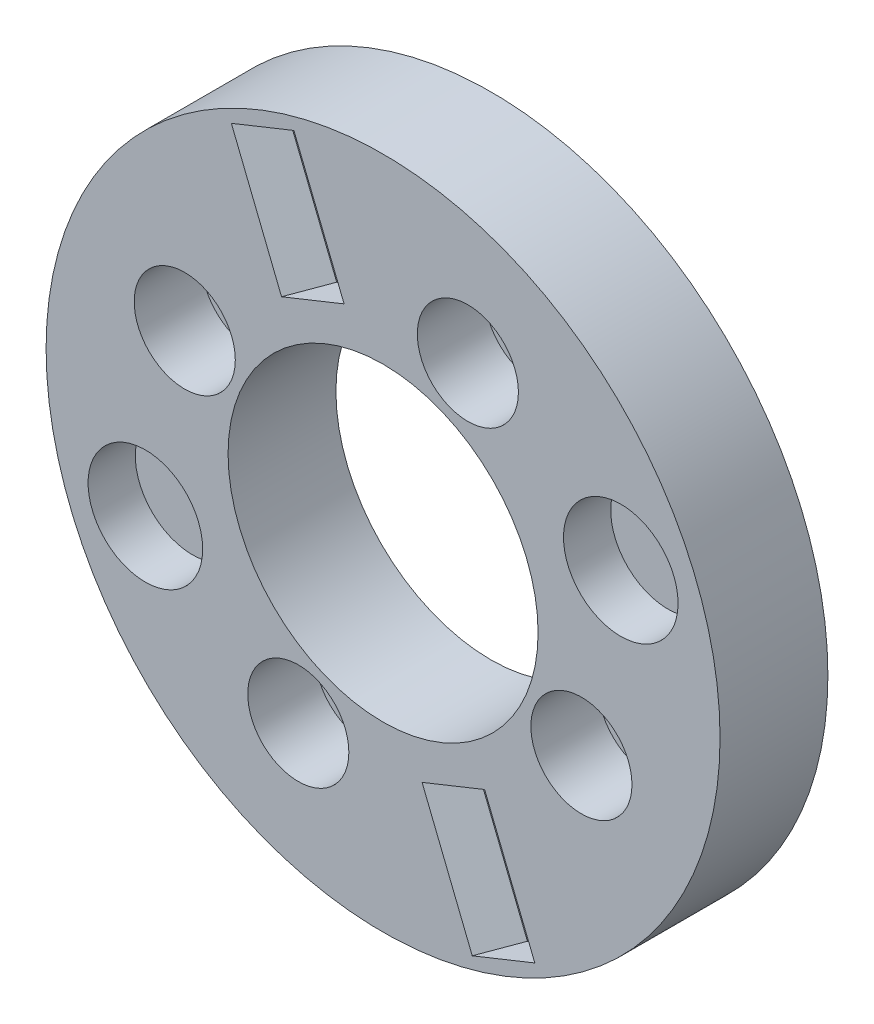
ISO-10303-21;
HEADER;
FILE_DESCRIPTION(('STEP AP214'),'2;1');
FILE_NAME('part.step','',(''),(''),'','','');
FILE_SCHEMA(('AUTOMOTIVE_DESIGN { 1 0 10303 214 1 1 1 1 }'));
ENDSEC;
DATA;
#1=APPLICATION_CONTEXT('core data for automotive mechanical design processes');
#2=APPLICATION_PROTOCOL_DEFINITION('international standard','automotive_design',2000,#1);
#3=PRODUCT_CONTEXT('',#1,'mechanical');
#4=PRODUCT('Part','Part','',(#3));
#5=PRODUCT_RELATED_PRODUCT_CATEGORY('part','',(#4));
#6=PRODUCT_DEFINITION_FORMATION('','',#4);
#7=PRODUCT_DEFINITION_CONTEXT('part definition',#1,'design');
#8=PRODUCT_DEFINITION('design','',#6,#7);
#9=PRODUCT_DEFINITION_SHAPE('','',#8);
#10=(LENGTH_UNIT() NAMED_UNIT(*) SI_UNIT(.MILLI.,.METRE.));
#11=(NAMED_UNIT(*) PLANE_ANGLE_UNIT() SI_UNIT($,.RADIAN.));
#12=(NAMED_UNIT(*) SI_UNIT($,.STERADIAN.) SOLID_ANGLE_UNIT());
#13=UNCERTAINTY_MEASURE_WITH_UNIT(LENGTH_MEASURE(1.E-05),#10,'distance_accuracy_value','');
#14=(GEOMETRIC_REPRESENTATION_CONTEXT(3) GLOBAL_UNCERTAINTY_ASSIGNED_CONTEXT((#13)) GLOBAL_UNIT_ASSIGNED_CONTEXT((#10,
#11,#12)) REPRESENTATION_CONTEXT('',''));
#15=CARTESIAN_POINT('',(0.,0.,0.));
#16=DIRECTION('',(0.,0.,1.));
#17=DIRECTION('',(1.,0.,0.));
#18=AXIS2_PLACEMENT_3D('',#15,#16,#17);
#19=CARTESIAN_POINT('',(0.,0.,8.));
#20=DIRECTION('',(0.,0.,1.));
#21=DIRECTION('',(1.,0.,0.));
#22=AXIS2_PLACEMENT_3D('',#19,#20,#21);
#23=PLANE('',#22);
#24=CARTESIAN_POINT('',(-17.6339330815767,-7.07420695728315,8.));
#25=DIRECTION('',(0.,0.,1.));
#26=DIRECTION('',(1.,0.,0.));
#27=AXIS2_PLACEMENT_3D('',#24,#25,#26);
#28=CIRCLE('',#27,4.25);
#29=CARTESIAN_POINT('',(-13.3839330815767,-7.07420695728315,8.));
#30=VERTEX_POINT('',#29);
#31=EDGE_CURVE('E139',#30,#30,#28,.T.);
#32=ORIENTED_EDGE('',*,*,#31,.F.);
#33=EDGE_LOOP('',(#32));
#34=FACE_BOUND('',#33,.T.);
#35=CARTESIAN_POINT('',(17.6339330815767,7.07420695728315,8.));
#36=DIRECTION('',(0.,0.,1.));
#37=DIRECTION('',(1.,0.,0.));
#38=AXIS2_PLACEMENT_3D('',#35,#36,#37);
#39=CIRCLE('',#38,4.25);
#40=CARTESIAN_POINT('',(21.8839330815767,7.07420695728315,8.));
#41=VERTEX_POINT('',#40);
#42=EDGE_CURVE('E147',#41,#41,#39,.T.);
#43=ORIENTED_EDGE('',*,*,#42,.F.);
#44=EDGE_LOOP('',(#43));
#45=FACE_BOUND('',#44,.T.);
#46=CARTESIAN_POINT('',(14.7133858318789,-6.28619736901935,8.));
#47=DIRECTION('',(0.,0.,1.));
#48=DIRECTION('',(1.,0.,0.));
#49=AXIS2_PLACEMENT_3D('',#46,#47,#48);
#50=CIRCLE('',#49,3.75);
#51=CARTESIAN_POINT('',(18.4633858318789,-6.28619736901935,8.));
#52=VERTEX_POINT('',#51);
#53=EDGE_CURVE('E202',#52,#52,#50,.T.);
#54=ORIENTED_EDGE('',*,*,#53,.F.);
#55=EDGE_LOOP('',(#54));
#56=FACE_BOUND('',#55,.T.);
#57=CARTESIAN_POINT('',(6.28955657002016,14.7119501818255,8.));
#58=DIRECTION('',(0.,0.,1.));
#59=DIRECTION('',(1.,0.,0.));
#60=AXIS2_PLACEMENT_3D('',#57,#58,#59);
#61=CIRCLE('',#60,3.75);
#62=CARTESIAN_POINT('',(10.0395565700202,14.7119501818255,8.));
#63=VERTEX_POINT('',#62);
#64=EDGE_CURVE('E208',#63,#63,#61,.T.);
#65=ORIENTED_EDGE('',*,*,#64,.F.);
#66=EDGE_LOOP('',(#65));
#67=FACE_BOUND('',#66,.T.);
#68=CARTESIAN_POINT('',(-14.7133858318789,6.28619736901935,8.));
#69=DIRECTION('',(0.,0.,1.));
#70=DIRECTION('',(1.,0.,0.));
#71=AXIS2_PLACEMENT_3D('',#68,#69,#70);
#72=CIRCLE('',#71,3.75);
#73=CARTESIAN_POINT('',(-10.9633858318789,6.28619736901935,8.));
#74=VERTEX_POINT('',#73);
#75=EDGE_CURVE('E191',#74,#74,#72,.T.);
#76=ORIENTED_EDGE('',*,*,#75,.F.);
#77=EDGE_LOOP('',(#76));
#78=FACE_BOUND('',#77,.T.);
#79=CARTESIAN_POINT('',(-6.28955657002016,-14.7119501818255,8.));
#80=DIRECTION('',(0.,0.,1.));
#81=DIRECTION('',(1.,0.,0.));
#82=AXIS2_PLACEMENT_3D('',#79,#80,#81);
#83=CIRCLE('',#82,3.75);
#84=CARTESIAN_POINT('',(-2.53955657002016,-14.7119501818255,8.));
#85=VERTEX_POINT('',#84);
#86=EDGE_CURVE('E220',#85,#85,#83,.T.);
#87=ORIENTED_EDGE('',*,*,#86,.F.);
#88=EDGE_LOOP('',(#87));
#89=FACE_BOUND('',#88,.T.);
#90=CARTESIAN_POINT('',(0.,0.,8.));
#91=DIRECTION('',(0.,0.,1.));
#92=DIRECTION('',(1.,0.,0.));
#93=AXIS2_PLACEMENT_3D('',#90,#91,#92);
#94=CIRCLE('',#93,25.);
#95=CARTESIAN_POINT('',(25.,0.,8.));
#96=VERTEX_POINT('',#95);
#97=EDGE_CURVE('E11',#96,#96,#94,.T.);
#98=ORIENTED_EDGE('',*,*,#97,.T.);
#99=EDGE_LOOP('',(#98));
#100=FACE_BOUND('',#99,.T.);
#101=CARTESIAN_POINT('',(0.,0.,8.));
#102=DIRECTION('',(0.,0.,1.));
#103=DIRECTION('',(1.,0.,0.));
#104=AXIS2_PLACEMENT_3D('',#101,#102,#103);
#105=CIRCLE('',#104,11.5);
#106=CARTESIAN_POINT('',(11.5,0.,8.));
#107=VERTEX_POINT('',#106);
#108=EDGE_CURVE('E236',#107,#107,#105,.T.);
#109=ORIENTED_EDGE('',*,*,#108,.F.);
#110=EDGE_LOOP('',(#109));
#111=FACE_BOUND('',#110,.T.);
#112=DIRECTION('',(-0.372326681962271,0.928101741135618,0.));
#113=VECTOR('',#112,1.);
#114=CARTESIAN_POINT('',(11.2560947199335,-21.3436250823492,8.));
#115=LINE('',#114,#113);
#116=CARTESIAN_POINT('',(11.2560947199335,-21.3436250823492,8.));
#117=VERTEX_POINT('',#116);
#118=CARTESIAN_POINT('',(7.53282790031084,-12.062607670993,8.));
#119=VERTEX_POINT('',#118);
#120=EDGE_CURVE('E189',#117,#119,#115,.T.);
#121=ORIENTED_EDGE('',*,*,#120,.F.);
#122=DIRECTION('',(0.928101741135618,0.372326681962271,0.));
#123=VECTOR('',#122,1.);
#124=CARTESIAN_POINT('',(11.2560947199335,-21.3436250823492,8.));
#125=LINE('',#124,#123);
#126=CARTESIAN_POINT('',(6.61558601425545,-23.2052584921605,8.));
#127=VERTEX_POINT('',#126);
#128=EDGE_CURVE('E177',#127,#117,#125,.T.);
#129=ORIENTED_EDGE('',*,*,#128,.F.);
#130=DIRECTION('',(-0.372326681962271,0.928101741135618,0.));
#131=VECTOR('',#130,1.);
#132=CARTESIAN_POINT('',(6.61558601425545,-23.2052584921605,8.));
#133=LINE('',#132,#131);
#134=CARTESIAN_POINT('',(2.89231919463274,-13.9242410808043,8.));
#135=VERTEX_POINT('',#134);
#136=EDGE_CURVE('E192',#127,#135,#133,.T.);
#137=ORIENTED_EDGE('',*,*,#136,.T.);
#138=DIRECTION('',(0.928101741135618,0.372326681962271,0.));
#139=VECTOR('',#138,1.);
#140=CARTESIAN_POINT('',(7.53282790031084,-12.062607670993,8.));
#141=LINE('',#140,#139);
#142=EDGE_CURVE('E171',#135,#119,#141,.T.);
#143=ORIENTED_EDGE('',*,*,#142,.T.);
#144=EDGE_LOOP('',(#121,#129,#137,#143));
#145=FACE_BOUND('',#144,.T.);
#146=DIRECTION('',(0.372326681962271,-0.928101741135618,0.));
#147=VECTOR('',#146,1.);
#148=CARTESIAN_POINT('',(-11.2560947199335,21.3436250823492,8.));
#149=LINE('',#148,#147);
#150=CARTESIAN_POINT('',(-11.2560947199335,21.3436250823492,8.));
#151=VERTEX_POINT('',#150);
#152=CARTESIAN_POINT('',(-7.53282790031083,12.062607670993,8.));
#153=VERTEX_POINT('',#152);
#154=EDGE_CURVE('E52',#151,#153,#149,.T.);
#155=ORIENTED_EDGE('',*,*,#154,.F.);
#156=DIRECTION('',(0.928101741135618,0.372326681962271,0.));
#157=VECTOR('',#156,1.);
#158=CARTESIAN_POINT('',(-6.61558601425545,23.2052584921605,8.));
#159=LINE('',#158,#157);
#160=CARTESIAN_POINT('',(-6.61558601425545,23.2052584921605,8.));
#161=VERTEX_POINT('',#160);
#162=EDGE_CURVE('E123',#151,#161,#159,.T.);
#163=ORIENTED_EDGE('',*,*,#162,.T.);
#164=DIRECTION('',(0.372326681962271,-0.928101741135618,0.));
#165=VECTOR('',#164,1.);
#166=CARTESIAN_POINT('',(-6.61558601425545,23.2052584921605,8.));
#167=LINE('',#166,#165);
#168=CARTESIAN_POINT('',(-2.89231919463274,13.9242410808043,8.));
#169=VERTEX_POINT('',#168);
#170=EDGE_CURVE('E106',#161,#169,#167,.T.);
#171=ORIENTED_EDGE('',*,*,#170,.T.);
#172=DIRECTION('',(0.928101741135618,0.372326681962271,0.));
#173=VECTOR('',#172,1.);
#174=CARTESIAN_POINT('',(-2.89231919463274,13.9242410808043,8.));
#175=LINE('',#174,#173);
#176=EDGE_CURVE('E132',#153,#169,#175,.T.);
#177=ORIENTED_EDGE('',*,*,#176,.F.);
#178=EDGE_LOOP('',(#155,#163,#171,#177));
#179=FACE_BOUND('',#178,.T.);
#180=ADVANCED_FACE('F35',(#34,#45,#56,#67,#78,#89,#100,#111,#145,#179),#23,.T.);
#181=CARTESIAN_POINT('',(-14.7133858318789,6.28619736901935,0.));
#182=DIRECTION('',(0.,0.,1.));
#183=DIRECTION('',(1.,0.,0.));
#184=AXIS2_PLACEMENT_3D('',#181,#182,#183);
#185=CYLINDRICAL_SURFACE('',#184,2.5);
#186=CARTESIAN_POINT('',(-14.7133858318789,6.28619736901935,0.));
#187=DIRECTION('',(0.,0.,1.));
#188=DIRECTION('',(1.,0.,0.));
#189=AXIS2_PLACEMENT_3D('',#186,#187,#188);
#190=CIRCLE('',#189,2.5);
#191=CARTESIAN_POINT('',(-12.2133858318789,6.28619736901935,0.));
#192=VERTEX_POINT('',#191);
#193=EDGE_CURVE('E226',#192,#192,#190,.T.);
#194=ORIENTED_EDGE('',*,*,#193,.F.);
#195=EDGE_LOOP('',(#194));
#196=FACE_BOUND('',#195,.T.);
#197=CARTESIAN_POINT('',(-14.7133858318789,6.28619736901935,3.));
#198=DIRECTION('',(0.,0.,1.));
#199=DIRECTION('',(1.,0.,0.));
#200=AXIS2_PLACEMENT_3D('',#197,#198,#199);
#201=CIRCLE('',#200,2.5);
#202=CARTESIAN_POINT('',(-12.2133858318789,6.28619736901935,3.));
#203=VERTEX_POINT('',#202);
#204=EDGE_CURVE('E39',#203,#203,#201,.F.);
#205=ORIENTED_EDGE('',*,*,#204,.F.);
#206=EDGE_LOOP('',(#205));
#207=FACE_BOUND('',#206,.T.);
#208=ADVANCED_FACE('F255',(#196,#207),#185,.F.);
#209=CARTESIAN_POINT('',(14.7133858318789,-6.28619736901935,0.));
#210=DIRECTION('',(0.,0.,1.));
#211=DIRECTION('',(1.,0.,0.));
#212=AXIS2_PLACEMENT_3D('',#209,#210,#211);
#213=CYLINDRICAL_SURFACE('',#212,2.5);
#214=CARTESIAN_POINT('',(14.7133858318789,-6.28619736901935,0.));
#215=DIRECTION('',(0.,0.,1.));
#216=DIRECTION('',(1.,0.,0.));
#217=AXIS2_PLACEMENT_3D('',#214,#215,#216);
#218=CIRCLE('',#217,2.5);
#219=CARTESIAN_POINT('',(17.2133858318789,-6.28619736901935,0.));
#220=VERTEX_POINT('',#219);
#221=EDGE_CURVE('E227',#220,#220,#218,.T.);
#222=ORIENTED_EDGE('',*,*,#221,.F.);
#223=EDGE_LOOP('',(#222));
#224=FACE_BOUND('',#223,.T.);
#225=CARTESIAN_POINT('',(14.7133858318789,-6.28619736901935,3.));
#226=DIRECTION('',(0.,0.,1.));
#227=DIRECTION('',(1.,0.,0.));
#228=AXIS2_PLACEMENT_3D('',#225,#226,#227);
#229=CIRCLE('',#228,2.5);
#230=CARTESIAN_POINT('',(17.2133858318789,-6.28619736901935,3.));
#231=VERTEX_POINT('',#230);
#232=EDGE_CURVE('E246',#231,#231,#229,.F.);
#233=ORIENTED_EDGE('',*,*,#232,.F.);
#234=EDGE_LOOP('',(#233));
#235=FACE_BOUND('',#234,.T.);
#236=ADVANCED_FACE('F257',(#224,#235),#213,.F.);
#237=CARTESIAN_POINT('',(6.28955657002016,14.7119501818255,0.));
#238=DIRECTION('',(0.,0.,1.));
#239=DIRECTION('',(1.,0.,0.));
#240=AXIS2_PLACEMENT_3D('',#237,#238,#239);
#241=CYLINDRICAL_SURFACE('',#240,2.5);
#242=CARTESIAN_POINT('',(6.28955657002016,14.7119501818255,0.));
#243=DIRECTION('',(0.,0.,1.));
#244=DIRECTION('',(1.,0.,0.));
#245=AXIS2_PLACEMENT_3D('',#242,#243,#244);
#246=CIRCLE('',#245,2.5);
#247=CARTESIAN_POINT('',(8.78955657002016,14.7119501818255,0.));
#248=VERTEX_POINT('',#247);
#249=EDGE_CURVE('E223',#248,#248,#246,.T.);
#250=ORIENTED_EDGE('',*,*,#249,.F.);
#251=EDGE_LOOP('',(#250));
#252=FACE_BOUND('',#251,.T.);
#253=CARTESIAN_POINT('',(6.28955657002016,14.7119501818255,3.));
#254=DIRECTION('',(0.,0.,1.));
#255=DIRECTION('',(1.,0.,0.));
#256=AXIS2_PLACEMENT_3D('',#253,#254,#255);
#257=CIRCLE('',#256,2.5);
#258=CARTESIAN_POINT('',(8.78955657002016,14.7119501818255,3.));
#259=VERTEX_POINT('',#258);
#260=EDGE_CURVE('E201',#259,#259,#257,.F.);
#261=ORIENTED_EDGE('',*,*,#260,.F.);
#262=EDGE_LOOP('',(#261));
#263=FACE_BOUND('',#262,.T.);
#264=ADVANCED_FACE('F264',(#252,#263),#241,.F.);
#265=CARTESIAN_POINT('',(-6.28955657002016,-14.7119501818255,0.));
#266=DIRECTION('',(0.,0.,1.));
#267=DIRECTION('',(1.,0.,0.));
#268=AXIS2_PLACEMENT_3D('',#265,#266,#267);
#269=CYLINDRICAL_SURFACE('',#268,2.5);
#270=CARTESIAN_POINT('',(-6.28955657002016,-14.7119501818255,0.));
#271=DIRECTION('',(0.,0.,1.));
#272=DIRECTION('',(1.,0.,0.));
#273=AXIS2_PLACEMENT_3D('',#270,#271,#272);
#274=CIRCLE('',#273,2.5);
#275=CARTESIAN_POINT('',(-3.78955657002016,-14.7119501818255,0.));
#276=VERTEX_POINT('',#275);
#277=EDGE_CURVE('E230',#276,#276,#274,.T.);
#278=ORIENTED_EDGE('',*,*,#277,.F.);
#279=EDGE_LOOP('',(#278));
#280=FACE_BOUND('',#279,.T.);
#281=CARTESIAN_POINT('',(-6.28955657002016,-14.7119501818255,3.));
#282=DIRECTION('',(0.,0.,1.));
#283=DIRECTION('',(1.,0.,0.));
#284=AXIS2_PLACEMENT_3D('',#281,#282,#283);
#285=CIRCLE('',#284,2.5);
#286=CARTESIAN_POINT('',(-3.78955657002016,-14.7119501818255,3.));
#287=VERTEX_POINT('',#286);
#288=EDGE_CURVE('E219',#287,#287,#285,.F.);
#289=ORIENTED_EDGE('',*,*,#288,.F.);
#290=EDGE_LOOP('',(#289));
#291=FACE_BOUND('',#290,.T.);
#292=ADVANCED_FACE('F272',(#280,#291),#269,.F.);
#293=CARTESIAN_POINT('',(0.,0.,0.));
#294=DIRECTION('',(0.,0.,1.));
#295=DIRECTION('',(1.,0.,0.));
#296=AXIS2_PLACEMENT_3D('',#293,#294,#295);
#297=PLANE('',#296);
#298=CARTESIAN_POINT('',(7.07420695728314,-17.6339330815767,0.));
#299=DIRECTION('',(0.,0.,-1.));
#300=DIRECTION('',(-1.,0.,0.));
#301=AXIS2_PLACEMENT_3D('',#298,#299,#300);
#302=CIRCLE('',#301,4.25);
#303=CARTESIAN_POINT('',(2.82420695728315,-17.6339330815767,0.));
#304=VERTEX_POINT('',#303);
#305=EDGE_CURVE('E153',#304,#304,#302,.T.);
#306=ORIENTED_EDGE('',*,*,#305,.F.);
#307=EDGE_LOOP('',(#306));
#308=FACE_BOUND('',#307,.T.);
#309=CARTESIAN_POINT('',(-7.07420695728315,17.6339330815767,0.));
#310=DIRECTION('',(0.,0.,-1.));
#311=DIRECTION('',(-1.,0.,0.));
#312=AXIS2_PLACEMENT_3D('',#309,#310,#311);
#313=CIRCLE('',#312,4.25);
#314=CARTESIAN_POINT('',(-11.3242069572831,17.6339330815767,0.));
#315=VERTEX_POINT('',#314);
#316=EDGE_CURVE('E159',#315,#315,#313,.T.);
#317=ORIENTED_EDGE('',*,*,#316,.F.);
#318=EDGE_LOOP('',(#317));
#319=FACE_BOUND('',#318,.T.);
#320=ORIENTED_EDGE('',*,*,#249,.T.);
#321=EDGE_LOOP('',(#320));
#322=FACE_BOUND('',#321,.T.);
#323=ORIENTED_EDGE('',*,*,#221,.T.);
#324=EDGE_LOOP('',(#323));
#325=FACE_BOUND('',#324,.T.);
#326=ORIENTED_EDGE('',*,*,#277,.T.);
#327=EDGE_LOOP('',(#326));
#328=FACE_BOUND('',#327,.T.);
#329=ORIENTED_EDGE('',*,*,#193,.T.);
#330=EDGE_LOOP('',(#329));
#331=FACE_BOUND('',#330,.T.);
#332=CARTESIAN_POINT('',(0.,0.,0.));
#333=DIRECTION('',(0.,0.,1.));
#334=DIRECTION('',(1.,0.,0.));
#335=AXIS2_PLACEMENT_3D('',#332,#333,#334);
#336=CIRCLE('',#335,25.);
#337=CARTESIAN_POINT('',(25.,0.,0.));
#338=VERTEX_POINT('',#337);
#339=EDGE_CURVE('E44',#338,#338,#336,.T.);
#340=ORIENTED_EDGE('',*,*,#339,.F.);
#341=EDGE_LOOP('',(#340));
#342=FACE_BOUND('',#341,.T.);
#343=CARTESIAN_POINT('',(0.,0.,0.));
#344=DIRECTION('',(0.,0.,1.));
#345=DIRECTION('',(1.,0.,0.));
#346=AXIS2_PLACEMENT_3D('',#343,#344,#345);
#347=CIRCLE('',#346,11.5);
#348=CARTESIAN_POINT('',(11.5,0.,0.));
#349=VERTEX_POINT('',#348);
#350=EDGE_CURVE('E235',#349,#349,#347,.T.);
#351=ORIENTED_EDGE('',*,*,#350,.T.);
#352=EDGE_LOOP('',(#351));
#353=FACE_BOUND('',#352,.T.);
#354=ADVANCED_FACE('F277',(#308,#319,#322,#325,#328,#331,#342,#353),#297,.F.);
#355=CARTESIAN_POINT('',(0.,0.,8.));
#356=DIRECTION('',(0.,0.,-1.));
#357=DIRECTION('',(-1.,0.,0.));
#358=AXIS2_PLACEMENT_3D('',#355,#356,#357);
#359=CYLINDRICAL_SURFACE('',#358,25.);
#360=ORIENTED_EDGE('',*,*,#97,.F.);
#361=EDGE_LOOP('',(#360));
#362=FACE_BOUND('',#361,.T.);
#363=ORIENTED_EDGE('',*,*,#339,.T.);
#364=EDGE_LOOP('',(#363));
#365=FACE_BOUND('',#364,.T.);
#366=ADVANCED_FACE('F37',(#362,#365),#359,.T.);
#367=CARTESIAN_POINT('',(0.,0.,8.));
#368=DIRECTION('',(0.,0.,-1.));
#369=DIRECTION('',(-1.,0.,0.));
#370=AXIS2_PLACEMENT_3D('',#367,#368,#369);
#371=CYLINDRICAL_SURFACE('',#370,11.5);
#372=ORIENTED_EDGE('',*,*,#108,.T.);
#373=EDGE_LOOP('',(#372));
#374=FACE_BOUND('',#373,.T.);
#375=ORIENTED_EDGE('',*,*,#350,.F.);
#376=EDGE_LOOP('',(#375));
#377=FACE_BOUND('',#376,.T.);
#378=ADVANCED_FACE('F273',(#374,#377),#371,.F.);
#379=CARTESIAN_POINT('',(-6.28955657002016,-14.7119501818255,3.));
#380=DIRECTION('',(0.,0.,1.));
#381=DIRECTION('',(1.,0.,0.));
#382=AXIS2_PLACEMENT_3D('',#379,#380,#381);
#383=PLANE('',#382);
#384=CARTESIAN_POINT('',(-6.28955657002016,-14.7119501818255,3.));
#385=DIRECTION('',(0.,0.,1.));
#386=DIRECTION('',(1.,0.,0.));
#387=AXIS2_PLACEMENT_3D('',#384,#385,#386);
#388=CIRCLE('',#387,3.75);
#389=CARTESIAN_POINT('',(-2.53955657002016,-14.7119501818255,3.));
#390=VERTEX_POINT('',#389);
#391=EDGE_CURVE('E216',#390,#390,#388,.T.);
#392=ORIENTED_EDGE('',*,*,#391,.T.);
#393=EDGE_LOOP('',(#392));
#394=FACE_BOUND('',#393,.T.);
#395=ORIENTED_EDGE('',*,*,#288,.T.);
#396=EDGE_LOOP('',(#395));
#397=FACE_BOUND('',#396,.T.);
#398=ADVANCED_FACE('F275',(#394,#397),#383,.T.);
#399=CARTESIAN_POINT('',(-6.28955657002016,-14.7119501818255,3.));
#400=DIRECTION('',(0.,0.,1.));
#401=DIRECTION('',(1.,0.,0.));
#402=AXIS2_PLACEMENT_3D('',#399,#400,#401);
#403=CYLINDRICAL_SURFACE('',#402,3.75);
#404=ORIENTED_EDGE('',*,*,#391,.F.);
#405=EDGE_LOOP('',(#404));
#406=FACE_BOUND('',#405,.T.);
#407=ORIENTED_EDGE('',*,*,#86,.T.);
#408=EDGE_LOOP('',(#407));
#409=FACE_BOUND('',#408,.T.);
#410=ADVANCED_FACE('F306',(#406,#409),#403,.F.);
#411=CARTESIAN_POINT('',(6.28955657002016,14.7119501818255,3.));
#412=DIRECTION('',(0.,0.,1.));
#413=DIRECTION('',(1.,0.,0.));
#414=AXIS2_PLACEMENT_3D('',#411,#412,#413);
#415=PLANE('',#414);
#416=CARTESIAN_POINT('',(6.28955657002016,14.7119501818255,3.));
#417=DIRECTION('',(0.,0.,1.));
#418=DIRECTION('',(1.,0.,0.));
#419=AXIS2_PLACEMENT_3D('',#416,#417,#418);
#420=CIRCLE('',#419,3.75);
#421=CARTESIAN_POINT('',(10.0395565700202,14.7119501818255,3.));
#422=VERTEX_POINT('',#421);
#423=EDGE_CURVE('E205',#422,#422,#420,.T.);
#424=ORIENTED_EDGE('',*,*,#423,.T.);
#425=EDGE_LOOP('',(#424));
#426=FACE_BOUND('',#425,.T.);
#427=ORIENTED_EDGE('',*,*,#260,.T.);
#428=EDGE_LOOP('',(#427));
#429=FACE_BOUND('',#428,.T.);
#430=ADVANCED_FACE('F312',(#426,#429),#415,.T.);
#431=CARTESIAN_POINT('',(6.28955657002016,14.7119501818255,3.));
#432=DIRECTION('',(0.,0.,1.));
#433=DIRECTION('',(1.,0.,0.));
#434=AXIS2_PLACEMENT_3D('',#431,#432,#433);
#435=CYLINDRICAL_SURFACE('',#434,3.75);
#436=ORIENTED_EDGE('',*,*,#423,.F.);
#437=EDGE_LOOP('',(#436));
#438=FACE_BOUND('',#437,.T.);
#439=ORIENTED_EDGE('',*,*,#64,.T.);
#440=EDGE_LOOP('',(#439));
#441=FACE_BOUND('',#440,.T.);
#442=ADVANCED_FACE('F327',(#438,#441),#435,.F.);
#443=CARTESIAN_POINT('',(14.7133858318789,-6.28619736901935,3.));
#444=DIRECTION('',(0.,0.,1.));
#445=DIRECTION('',(1.,0.,0.));
#446=AXIS2_PLACEMENT_3D('',#443,#444,#445);
#447=PLANE('',#446);
#448=CARTESIAN_POINT('',(14.7133858318789,-6.28619736901935,3.));
#449=DIRECTION('',(0.,0.,1.));
#450=DIRECTION('',(1.,0.,0.));
#451=AXIS2_PLACEMENT_3D('',#448,#449,#450);
#452=CIRCLE('',#451,3.75);
#453=CARTESIAN_POINT('',(18.4633858318789,-6.28619736901935,3.));
#454=VERTEX_POINT('',#453);
#455=EDGE_CURVE('E198',#454,#454,#452,.T.);
#456=ORIENTED_EDGE('',*,*,#455,.T.);
#457=EDGE_LOOP('',(#456));
#458=FACE_BOUND('',#457,.T.);
#459=ORIENTED_EDGE('',*,*,#232,.T.);
#460=EDGE_LOOP('',(#459));
#461=FACE_BOUND('',#460,.T.);
#462=ADVANCED_FACE('F333',(#458,#461),#447,.T.);
#463=CARTESIAN_POINT('',(14.7133858318789,-6.28619736901935,3.));
#464=DIRECTION('',(0.,0.,1.));
#465=DIRECTION('',(1.,0.,0.));
#466=AXIS2_PLACEMENT_3D('',#463,#464,#465);
#467=CYLINDRICAL_SURFACE('',#466,3.75);
#468=ORIENTED_EDGE('',*,*,#455,.F.);
#469=EDGE_LOOP('',(#468));
#470=FACE_BOUND('',#469,.T.);
#471=ORIENTED_EDGE('',*,*,#53,.T.);
#472=EDGE_LOOP('',(#471));
#473=FACE_BOUND('',#472,.T.);
#474=ADVANCED_FACE('F337',(#470,#473),#467,.F.);
#475=CARTESIAN_POINT('',(-14.7133858318789,6.28619736901935,3.));
#476=DIRECTION('',(0.,0.,1.));
#477=DIRECTION('',(1.,0.,0.));
#478=AXIS2_PLACEMENT_3D('',#475,#476,#477);
#479=PLANE('',#478);
#480=CARTESIAN_POINT('',(-14.7133858318789,6.28619736901935,3.));
#481=DIRECTION('',(0.,0.,1.));
#482=DIRECTION('',(1.,0.,0.));
#483=AXIS2_PLACEMENT_3D('',#480,#481,#482);
#484=CIRCLE('',#483,3.75);
#485=CARTESIAN_POINT('',(-10.9633858318789,6.28619736901935,3.));
#486=VERTEX_POINT('',#485);
#487=EDGE_CURVE('E211',#486,#486,#484,.T.);
#488=ORIENTED_EDGE('',*,*,#487,.T.);
#489=EDGE_LOOP('',(#488));
#490=FACE_BOUND('',#489,.T.);
#491=ORIENTED_EDGE('',*,*,#204,.T.);
#492=EDGE_LOOP('',(#491));
#493=FACE_BOUND('',#492,.T.);
#494=ADVANCED_FACE('F253',(#490,#493),#479,.T.);
#495=CARTESIAN_POINT('',(-14.7133858318789,6.28619736901935,3.));
#496=DIRECTION('',(0.,0.,1.));
#497=DIRECTION('',(1.,0.,0.));
#498=AXIS2_PLACEMENT_3D('',#495,#496,#497);
#499=CYLINDRICAL_SURFACE('',#498,3.75);
#500=ORIENTED_EDGE('',*,*,#487,.F.);
#501=EDGE_LOOP('',(#500));
#502=FACE_BOUND('',#501,.T.);
#503=ORIENTED_EDGE('',*,*,#75,.T.);
#504=EDGE_LOOP('',(#503));
#505=FACE_BOUND('',#504,.T.);
#506=ADVANCED_FACE('F316',(#502,#505),#499,.F.);
#507=CARTESIAN_POINT('',(9.39989123766231,-22.0882784462737,5.76393202250021));
#508=DIRECTION('',(0.691766194405052,0.277515923568194,-0.666666666666667));
#509=DIRECTION('',(-0.693923251960421,0.,-0.720048970826758));
#510=AXIS2_PLACEMENT_3D('',#507,#508,#509);
#511=PLANE('',#510);
#512=DIRECTION('',(-0.618734494090412,-0.248217787974847,-0.74535599249993));
#513=VECTOR('',#512,1.);
#514=CARTESIAN_POINT('',(5.6766244180396,-12.8072610349175,5.76393202250021));
#515=LINE('',#514,#513);
#516=CARTESIAN_POINT('',(5.6766244180396,-12.8072610349175,5.76393202250021));
#517=VERTEX_POINT('',#516);
#518=EDGE_CURVE('E60',#119,#517,#515,.T.);
#519=ORIENTED_EDGE('',*,*,#518,.T.);
#520=DIRECTION('',(-0.372326681962271,0.928101741135618,0.));
#521=VECTOR('',#520,1.);
#522=CARTESIAN_POINT('',(9.39989123766231,-22.0882784462737,5.76393202250021));
#523=LINE('',#522,#521);
#524=CARTESIAN_POINT('',(9.39989123766231,-22.0882784462737,5.76393202250021));
#525=VERTEX_POINT('',#524);
#526=EDGE_CURVE('E180',#525,#517,#523,.T.);
#527=ORIENTED_EDGE('',*,*,#526,.F.);
#528=DIRECTION('',(-0.618734494090412,-0.248217787974847,-0.74535599249993));
#529=VECTOR('',#528,1.);
#530=CARTESIAN_POINT('',(9.39989123766231,-22.0882784462737,5.76393202250021));
#531=LINE('',#530,#529);
#532=EDGE_CURVE('E167',#117,#525,#531,.T.);
#533=ORIENTED_EDGE('',*,*,#532,.F.);
#534=ORIENTED_EDGE('',*,*,#120,.T.);
#535=EDGE_LOOP('',(#519,#527,#533,#534));
#536=FACE_BOUND('',#535,.T.);
#537=ADVANCED_FACE('F345',(#536),#511,.F.);
#538=CARTESIAN_POINT('',(6.61558601425545,-23.2052584921605,8.));
#539=DIRECTION('',(-0.691766194405052,-0.277515923568194,-0.666666666666667));
#540=DIRECTION('',(-0.693923251960421,0.,0.720048970826758));
#541=AXIS2_PLACEMENT_3D('',#538,#539,#540);
#542=PLANE('',#541);
#543=DIRECTION('',(-0.618734494090412,-0.248217787974847,0.74535599249993));
#544=VECTOR('',#543,1.);
#545=CARTESIAN_POINT('',(2.89231919463274,-13.9242410808043,8.));
#546=LINE('',#545,#544);
#547=CARTESIAN_POINT('',(4.74852267690398,-13.1795877168798,5.76393202250021));
#548=VERTEX_POINT('',#547);
#549=EDGE_CURVE('E185',#548,#135,#546,.T.);
#550=ORIENTED_EDGE('',*,*,#549,.T.);
#551=ORIENTED_EDGE('',*,*,#136,.F.);
#552=DIRECTION('',(-0.618734494090412,-0.248217787974847,0.74535599249993));
#553=VECTOR('',#552,1.);
#554=CARTESIAN_POINT('',(6.61558601425545,-23.2052584921605,8.));
#555=LINE('',#554,#553);
#556=CARTESIAN_POINT('',(8.47178949652669,-22.460605128236,5.76393202250021));
#557=VERTEX_POINT('',#556);
#558=EDGE_CURVE('E174',#557,#127,#555,.T.);
#559=ORIENTED_EDGE('',*,*,#558,.F.);
#560=DIRECTION('',(-0.372326681962271,0.928101741135618,0.));
#561=VECTOR('',#560,1.);
#562=CARTESIAN_POINT('',(8.47178949652669,-22.460605128236,5.76393202250021));
#563=LINE('',#562,#561);
#564=EDGE_CURVE('E195',#557,#548,#563,.T.);
#565=ORIENTED_EDGE('',*,*,#564,.T.);
#566=EDGE_LOOP('',(#550,#551,#559,#565));
#567=FACE_BOUND('',#566,.T.);
#568=ADVANCED_FACE('F367',(#567),#542,.F.);
#569=CARTESIAN_POINT('',(8.47178949652669,-22.460605128236,5.76393202250021));
#570=DIRECTION('',(0.,0.,-1.));
#571=DIRECTION('',(-1.,0.,0.));
#572=AXIS2_PLACEMENT_3D('',#569,#570,#571);
#573=PLANE('',#572);
#574=DIRECTION('',(-0.928101741135618,-0.372326681962271,0.));
#575=VECTOR('',#574,1.);
#576=CARTESIAN_POINT('',(4.74852267690398,-13.1795877168798,5.76393202250021));
#577=LINE('',#576,#575);
#578=EDGE_CURVE('E182',#517,#548,#577,.T.);
#579=ORIENTED_EDGE('',*,*,#578,.T.);
#580=ORIENTED_EDGE('',*,*,#564,.F.);
#581=DIRECTION('',(-0.928101741135618,-0.372326681962271,0.));
#582=VECTOR('',#581,1.);
#583=CARTESIAN_POINT('',(8.47178949652669,-22.460605128236,5.76393202250021));
#584=LINE('',#583,#582);
#585=EDGE_CURVE('E170',#525,#557,#584,.T.);
#586=ORIENTED_EDGE('',*,*,#585,.F.);
#587=ORIENTED_EDGE('',*,*,#526,.T.);
#588=EDGE_LOOP('',(#579,#580,#586,#587));
#589=FACE_BOUND('',#588,.T.);
#590=ADVANCED_FACE('F380',(#589),#573,.F.);
#591=CARTESIAN_POINT('',(8.9358403670945,-22.2744417872548,0.));
#592=DIRECTION('',(-0.372326681962271,0.928101741135618,0.));
#593=DIRECTION('',(-0.928101741135618,-0.372326681962271,0.));
#594=AXIS2_PLACEMENT_3D('',#591,#592,#593);
#595=PLANE('',#594);
#596=ORIENTED_EDGE('',*,*,#532,.T.);
#597=ORIENTED_EDGE('',*,*,#585,.T.);
#598=ORIENTED_EDGE('',*,*,#558,.T.);
#599=ORIENTED_EDGE('',*,*,#128,.T.);
#600=EDGE_LOOP('',(#596,#597,#598,#599));
#601=FACE_BOUND('',#600,.T.);
#602=ADVANCED_FACE('F364',(#601),#595,.T.);
#603=CARTESIAN_POINT('',(5.21257354747179,-12.9934243758987,0.));
#604=DIRECTION('',(-0.372326681962271,0.928101741135618,0.));
#605=DIRECTION('',(-0.928101741135618,-0.372326681962271,0.));
#606=AXIS2_PLACEMENT_3D('',#603,#604,#605);
#607=PLANE('',#606);
#608=ORIENTED_EDGE('',*,*,#518,.F.);
#609=ORIENTED_EDGE('',*,*,#142,.F.);
#610=ORIENTED_EDGE('',*,*,#549,.F.);
#611=ORIENTED_EDGE('',*,*,#578,.F.);
#612=EDGE_LOOP('',(#608,#609,#610,#611));
#613=FACE_BOUND('',#612,.T.);
#614=ADVANCED_FACE('F369',(#613),#607,.F.);
#615=CARTESIAN_POINT('',(-7.07420695728315,17.6339330815767,3.5));
#616=DIRECTION('',(0.,0.,-1.));
#617=DIRECTION('',(-1.,0.,0.));
#618=AXIS2_PLACEMENT_3D('',#615,#616,#617);
#619=CYLINDRICAL_SURFACE('',#618,4.25);
#620=CARTESIAN_POINT('',(-7.07420695728315,17.6339330815767,3.5));
#621=DIRECTION('',(0.,0.,-1.));
#622=DIRECTION('',(-1.,0.,0.));
#623=AXIS2_PLACEMENT_3D('',#620,#621,#622);
#624=CIRCLE('',#623,4.25);
#625=CARTESIAN_POINT('',(-11.3242069572831,17.6339330815767,3.5));
#626=VERTEX_POINT('',#625);
#627=EDGE_CURVE('E162',#626,#626,#624,.T.);
#628=ORIENTED_EDGE('',*,*,#627,.F.);
#629=EDGE_LOOP('',(#628));
#630=FACE_BOUND('',#629,.T.);
#631=ORIENTED_EDGE('',*,*,#316,.T.);
#632=EDGE_LOOP('',(#631));
#633=FACE_BOUND('',#632,.T.);
#634=ADVANCED_FACE('F371',(#630,#633),#619,.F.);
#635=CARTESIAN_POINT('',(-7.07420695728315,17.6339330815767,3.5));
#636=DIRECTION('',(0.,0.,-1.));
#637=DIRECTION('',(-1.,0.,0.));
#638=AXIS2_PLACEMENT_3D('',#635,#636,#637);
#639=PLANE('',#638);
#640=ORIENTED_EDGE('',*,*,#627,.T.);
#641=EDGE_LOOP('',(#640));
#642=FACE_BOUND('',#641,.T.);
#643=ADVANCED_FACE('F377',(#642),#639,.T.);
#644=CARTESIAN_POINT('',(7.07420695728314,-17.6339330815767,3.5));
#645=DIRECTION('',(0.,0.,-1.));
#646=DIRECTION('',(-1.,0.,0.));
#647=AXIS2_PLACEMENT_3D('',#644,#645,#646);
#648=CYLINDRICAL_SURFACE('',#647,4.25);
#649=CARTESIAN_POINT('',(7.07420695728314,-17.6339330815767,3.5));
#650=DIRECTION('',(0.,0.,-1.));
#651=DIRECTION('',(-1.,0.,0.));
#652=AXIS2_PLACEMENT_3D('',#649,#650,#651);
#653=CIRCLE('',#652,4.25);
#654=CARTESIAN_POINT('',(2.82420695728315,-17.6339330815767,3.5));
#655=VERTEX_POINT('',#654);
#656=EDGE_CURVE('E156',#655,#655,#653,.T.);
#657=ORIENTED_EDGE('',*,*,#656,.F.);
#658=EDGE_LOOP('',(#657));
#659=FACE_BOUND('',#658,.T.);
#660=ORIENTED_EDGE('',*,*,#305,.T.);
#661=EDGE_LOOP('',(#660));
#662=FACE_BOUND('',#661,.T.);
#663=ADVANCED_FACE('F464',(#659,#662),#648,.F.);
#664=CARTESIAN_POINT('',(7.07420695728314,-17.6339330815767,3.5));
#665=DIRECTION('',(0.,0.,-1.));
#666=DIRECTION('',(-1.,0.,0.));
#667=AXIS2_PLACEMENT_3D('',#664,#665,#666);
#668=PLANE('',#667);
#669=ORIENTED_EDGE('',*,*,#656,.T.);
#670=EDGE_LOOP('',(#669));
#671=FACE_BOUND('',#670,.T.);
#672=ADVANCED_FACE('F474',(#671),#668,.T.);
#673=CARTESIAN_POINT('',(17.6339330815767,7.07420695728315,4.5));
#674=DIRECTION('',(0.,0.,1.));
#675=DIRECTION('',(1.,0.,0.));
#676=AXIS2_PLACEMENT_3D('',#673,#674,#675);
#677=CYLINDRICAL_SURFACE('',#676,4.25);
#678=CARTESIAN_POINT('',(17.6339330815767,7.07420695728315,4.5));
#679=DIRECTION('',(0.,0.,1.));
#680=DIRECTION('',(1.,0.,0.));
#681=AXIS2_PLACEMENT_3D('',#678,#679,#680);
#682=CIRCLE('',#681,4.25);
#683=CARTESIAN_POINT('',(21.8839330815767,7.07420695728315,4.5));
#684=VERTEX_POINT('',#683);
#685=EDGE_CURVE('E150',#684,#684,#682,.T.);
#686=ORIENTED_EDGE('',*,*,#685,.F.);
#687=EDGE_LOOP('',(#686));
#688=FACE_BOUND('',#687,.T.);
#689=ORIENTED_EDGE('',*,*,#42,.T.);
#690=EDGE_LOOP('',(#689));
#691=FACE_BOUND('',#690,.T.);
#692=ADVANCED_FACE('F484',(#688,#691),#677,.F.);
#693=CARTESIAN_POINT('',(17.6339330815767,7.07420695728315,4.5));
#694=DIRECTION('',(0.,0.,1.));
#695=DIRECTION('',(1.,0.,0.));
#696=AXIS2_PLACEMENT_3D('',#693,#694,#695);
#697=PLANE('',#696);
#698=ORIENTED_EDGE('',*,*,#685,.T.);
#699=EDGE_LOOP('',(#698));
#700=FACE_BOUND('',#699,.T.);
#701=ADVANCED_FACE('F494',(#700),#697,.T.);
#702=CARTESIAN_POINT('',(-17.6339330815767,-7.07420695728315,4.5));
#703=DIRECTION('',(0.,0.,1.));
#704=DIRECTION('',(1.,0.,0.));
#705=AXIS2_PLACEMENT_3D('',#702,#703,#704);
#706=CYLINDRICAL_SURFACE('',#705,4.25);
#707=CARTESIAN_POINT('',(-17.6339330815767,-7.07420695728315,4.5));
#708=DIRECTION('',(0.,0.,1.));
#709=DIRECTION('',(1.,0.,0.));
#710=AXIS2_PLACEMENT_3D('',#707,#708,#709);
#711=CIRCLE('',#710,4.25);
#712=CARTESIAN_POINT('',(-13.3839330815767,-7.07420695728315,4.5));
#713=VERTEX_POINT('',#712);
#714=EDGE_CURVE('E144',#713,#713,#711,.T.);
#715=ORIENTED_EDGE('',*,*,#714,.F.);
#716=EDGE_LOOP('',(#715));
#717=FACE_BOUND('',#716,.T.);
#718=ORIENTED_EDGE('',*,*,#31,.T.);
#719=EDGE_LOOP('',(#718));
#720=FACE_BOUND('',#719,.T.);
#721=ADVANCED_FACE('F504',(#717,#720),#706,.F.);
#722=CARTESIAN_POINT('',(-17.6339330815767,-7.07420695728315,4.5));
#723=DIRECTION('',(0.,0.,1.));
#724=DIRECTION('',(1.,0.,0.));
#725=AXIS2_PLACEMENT_3D('',#722,#723,#724);
#726=PLANE('',#725);
#727=ORIENTED_EDGE('',*,*,#714,.T.);
#728=EDGE_LOOP('',(#727));
#729=FACE_BOUND('',#728,.T.);
#730=ADVANCED_FACE('F514',(#729),#726,.T.);
#731=CARTESIAN_POINT('',(-8.47178949652668,22.460605128236,5.76393202250021));
#732=DIRECTION('',(-0.691766194405052,-0.277515923568194,0.666666666666667));
#733=DIRECTION('',(0.693923251960421,0.,0.720048970826758));
#734=AXIS2_PLACEMENT_3D('',#731,#732,#733);
#735=PLANE('',#734);
#736=DIRECTION('',(-0.618734494090412,-0.248217787974847,-0.74535599249993));
#737=VECTOR('',#736,1.);
#738=CARTESIAN_POINT('',(-4.74852267690398,13.1795877168798,5.76393202250021));
#739=LINE('',#738,#737);
#740=CARTESIAN_POINT('',(-4.74852267690398,13.1795877168798,5.76393202250021));
#741=VERTEX_POINT('',#740);
#742=EDGE_CURVE('E113',#169,#741,#739,.T.);
#743=ORIENTED_EDGE('',*,*,#742,.F.);
#744=ORIENTED_EDGE('',*,*,#170,.F.);
#745=DIRECTION('',(-0.618734494090412,-0.248217787974847,-0.74535599249993));
#746=VECTOR('',#745,1.);
#747=CARTESIAN_POINT('',(-8.47178949652668,22.460605128236,5.76393202250021));
#748=LINE('',#747,#746);
#749=CARTESIAN_POINT('',(-8.47178949652668,22.460605128236,5.76393202250021));
#750=VERTEX_POINT('',#749);
#751=EDGE_CURVE('E110',#161,#750,#748,.T.);
#752=ORIENTED_EDGE('',*,*,#751,.T.);
#753=DIRECTION('',(0.372326681962271,-0.928101741135618,0.));
#754=VECTOR('',#753,1.);
#755=CARTESIAN_POINT('',(-8.47178949652668,22.460605128236,5.76393202250021));
#756=LINE('',#755,#754);
#757=EDGE_CURVE('E137',#750,#741,#756,.T.);
#758=ORIENTED_EDGE('',*,*,#757,.T.);
#759=EDGE_LOOP('',(#743,#744,#752,#758));
#760=FACE_BOUND('',#759,.T.);
#761=ADVANCED_FACE('F108',(#760),#735,.T.);
#762=CARTESIAN_POINT('',(-9.3998912376623,22.0882784462737,5.76393202250021));
#763=DIRECTION('',(0.,0.,1.));
#764=DIRECTION('',(1.,0.,0.));
#765=AXIS2_PLACEMENT_3D('',#762,#763,#764);
#766=PLANE('',#765);
#767=DIRECTION('',(-0.928101741135618,-0.372326681962271,0.));
#768=VECTOR('',#767,1.);
#769=CARTESIAN_POINT('',(-5.6766244180396,12.8072610349175,5.76393202250021));
#770=LINE('',#769,#768);
#771=CARTESIAN_POINT('',(-5.6766244180396,12.8072610349175,5.76393202250021));
#772=VERTEX_POINT('',#771);
#773=EDGE_CURVE('E124',#741,#772,#770,.T.);
#774=ORIENTED_EDGE('',*,*,#773,.F.);
#775=ORIENTED_EDGE('',*,*,#757,.F.);
#776=DIRECTION('',(-0.928101741135618,-0.372326681962271,0.));
#777=VECTOR('',#776,1.);
#778=CARTESIAN_POINT('',(-9.3998912376623,22.0882784462737,5.76393202250021));
#779=LINE('',#778,#777);
#780=CARTESIAN_POINT('',(-9.3998912376623,22.0882784462737,5.76393202250021));
#781=VERTEX_POINT('',#780);
#782=EDGE_CURVE('E117',#750,#781,#779,.T.);
#783=ORIENTED_EDGE('',*,*,#782,.T.);
#784=DIRECTION('',(0.372326681962271,-0.928101741135618,0.));
#785=VECTOR('',#784,1.);
#786=CARTESIAN_POINT('',(-9.3998912376623,22.0882784462737,5.76393202250021));
#787=LINE('',#786,#785);
#788=EDGE_CURVE('E140',#781,#772,#787,.T.);
#789=ORIENTED_EDGE('',*,*,#788,.T.);
#790=EDGE_LOOP('',(#774,#775,#783,#789));
#791=FACE_BOUND('',#790,.T.);
#792=ADVANCED_FACE('F539',(#791),#766,.T.);
#793=CARTESIAN_POINT('',(-11.2560947199335,21.3436250823492,8.));
#794=DIRECTION('',(0.691766194405052,0.277515923568194,0.666666666666667));
#795=DIRECTION('',(0.693923251960421,0.,-0.720048970826758));
#796=AXIS2_PLACEMENT_3D('',#793,#794,#795);
#797=PLANE('',#796);
#798=DIRECTION('',(-0.618734494090412,-0.248217787974847,0.74535599249993));
#799=VECTOR('',#798,1.);
#800=CARTESIAN_POINT('',(-7.53282790031083,12.062607670993,8.));
#801=LINE('',#800,#799);
#802=EDGE_CURVE('E134',#772,#153,#801,.T.);
#803=ORIENTED_EDGE('',*,*,#802,.F.);
#804=ORIENTED_EDGE('',*,*,#788,.F.);
#805=DIRECTION('',(-0.618734494090412,-0.248217787974847,0.74535599249993));
#806=VECTOR('',#805,1.);
#807=CARTESIAN_POINT('',(-11.2560947199335,21.3436250823492,8.));
#808=LINE('',#807,#806);
#809=EDGE_CURVE('E126',#781,#151,#808,.T.);
#810=ORIENTED_EDGE('',*,*,#809,.T.);
#811=ORIENTED_EDGE('',*,*,#154,.T.);
#812=EDGE_LOOP('',(#803,#804,#810,#811));
#813=FACE_BOUND('',#812,.T.);
#814=ADVANCED_FACE('F548',(#813),#797,.T.);
#815=CARTESIAN_POINT('',(-8.93584036709449,22.2744417872548,0.));
#816=DIRECTION('',(0.372326681962271,-0.928101741135618,0.));
#817=DIRECTION('',(-0.928101741135618,-0.372326681962271,0.));
#818=AXIS2_PLACEMENT_3D('',#815,#816,#817);
#819=PLANE('',#818);
#820=ORIENTED_EDGE('',*,*,#751,.F.);
#821=ORIENTED_EDGE('',*,*,#162,.F.);
#822=ORIENTED_EDGE('',*,*,#809,.F.);
#823=ORIENTED_EDGE('',*,*,#782,.F.);
#824=EDGE_LOOP('',(#820,#821,#822,#823));
#825=FACE_BOUND('',#824,.T.);
#826=ADVANCED_FACE('F121',(#825),#819,.T.);
#827=CARTESIAN_POINT('',(-5.21257354747179,12.9934243758987,0.));
#828=DIRECTION('',(0.372326681962271,-0.928101741135618,0.));
#829=DIRECTION('',(-0.928101741135618,-0.372326681962271,0.));
#830=AXIS2_PLACEMENT_3D('',#827,#828,#829);
#831=PLANE('',#830);
#832=ORIENTED_EDGE('',*,*,#742,.T.);
#833=ORIENTED_EDGE('',*,*,#773,.T.);
#834=ORIENTED_EDGE('',*,*,#802,.T.);
#835=ORIENTED_EDGE('',*,*,#176,.T.);
#836=EDGE_LOOP('',(#832,#833,#834,#835));
#837=FACE_BOUND('',#836,.T.);
#838=ADVANCED_FACE('F566',(#837),#831,.F.);
#839=CLOSED_SHELL('',(#180,#208,#236,#264,#292,#354,#366,#378,#398,#410,#430,#442,#462,#474,
#494,#506,#537,#568,#590,#602,#614,#634,#643,#663,#672,#692,#701,#721,#730,#761,#792,#814,#826,#838));
#840=MANIFOLD_SOLID_BREP('B2',#839);
#841=ADVANCED_BREP_SHAPE_REPRESENTATION('',(#18,#840),#14);
#842=SHAPE_DEFINITION_REPRESENTATION(#9,#841);
ENDSEC;
END-ISO-10303-21;
